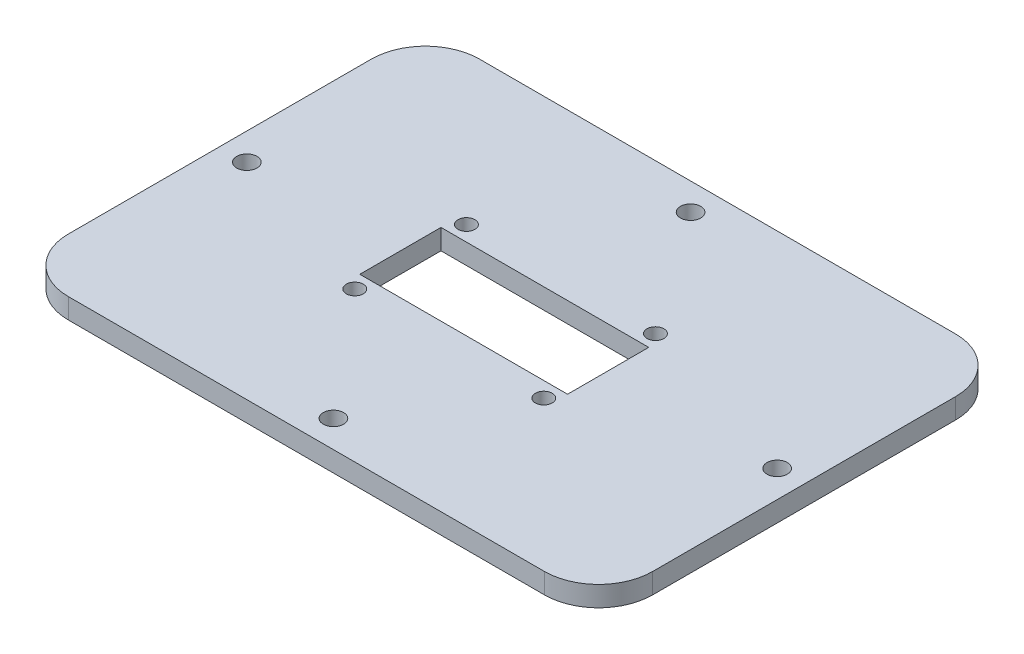
ISO-10303-21;
HEADER;
FILE_DESCRIPTION(('STEP AP214'),'2;1');
FILE_NAME('part.step','',(''),(''),'','','');
FILE_SCHEMA(('AUTOMOTIVE_DESIGN { 1 0 10303 214 1 1 1 1 }'));
ENDSEC;
DATA;
#1=APPLICATION_CONTEXT('core data for automotive mechanical design processes');
#2=APPLICATION_PROTOCOL_DEFINITION('international standard','automotive_design',2000,#1);
#3=PRODUCT_CONTEXT('',#1,'mechanical');
#4=PRODUCT('Part','Part','',(#3));
#5=PRODUCT_RELATED_PRODUCT_CATEGORY('part','',(#4));
#6=PRODUCT_DEFINITION_FORMATION('','',#4);
#7=PRODUCT_DEFINITION_CONTEXT('part definition',#1,'design');
#8=PRODUCT_DEFINITION('design','',#6,#7);
#9=PRODUCT_DEFINITION_SHAPE('','',#8);
#10=(LENGTH_UNIT() NAMED_UNIT(*) SI_UNIT(.MILLI.,.METRE.));
#11=(NAMED_UNIT(*) PLANE_ANGLE_UNIT() SI_UNIT($,.RADIAN.));
#12=(NAMED_UNIT(*) SI_UNIT($,.STERADIAN.) SOLID_ANGLE_UNIT());
#13=UNCERTAINTY_MEASURE_WITH_UNIT(LENGTH_MEASURE(1.E-05),#10,'distance_accuracy_value','');
#14=(GEOMETRIC_REPRESENTATION_CONTEXT(3) GLOBAL_UNCERTAINTY_ASSIGNED_CONTEXT((#13)) GLOBAL_UNIT_ASSIGNED_CONTEXT((#10,
#11,#12)) REPRESENTATION_CONTEXT('',''));
#15=CARTESIAN_POINT('',(0.,0.,0.));
#16=DIRECTION('',(0.,0.,1.));
#17=DIRECTION('',(1.,0.,0.));
#18=AXIS2_PLACEMENT_3D('',#15,#16,#17);
#19=CARTESIAN_POINT('',(-43.2,25.2,30.4));
#20=DIRECTION('',(0.,0.,-1.));
#21=DIRECTION('',(-1.,0.,0.));
#22=AXIS2_PLACEMENT_3D('',#19,#20,#21);
#23=PLANE('',#22);
#24=DIRECTION('',(1.,0.,0.));
#25=VECTOR('',#24,1.);
#26=CARTESIAN_POINT('',(35.2,22.2,30.4));
#27=LINE('',#26,#25);
#28=CARTESIAN_POINT('',(-35.2,22.2,30.4));
#29=VERTEX_POINT('',#28);
#30=CARTESIAN_POINT('',(35.2,22.2,30.4));
#31=VERTEX_POINT('',#30);
#32=EDGE_CURVE('E136',#29,#31,#27,.T.);
#33=ORIENTED_EDGE('',*,*,#32,.T.);
#34=DIRECTION('',(0.,-1.,0.));
#35=VECTOR('',#34,1.);
#36=CARTESIAN_POINT('',(35.2,25.2,30.4));
#37=LINE('',#36,#35);
#38=CARTESIAN_POINT('',(35.2,25.2,30.4));
#39=VERTEX_POINT('',#38);
#40=EDGE_CURVE('E161',#31,#39,#37,.F.);
#41=ORIENTED_EDGE('',*,*,#40,.T.);
#42=DIRECTION('',(1.,0.,0.));
#43=VECTOR('',#42,1.);
#44=CARTESIAN_POINT('',(-43.2,25.2,30.4));
#45=LINE('',#44,#43);
#46=CARTESIAN_POINT('',(-35.2,25.2,30.4));
#47=VERTEX_POINT('',#46);
#48=EDGE_CURVE('E159',#47,#39,#45,.T.);
#49=ORIENTED_EDGE('',*,*,#48,.F.);
#50=DIRECTION('',(0.,-1.,0.));
#51=VECTOR('',#50,1.);
#52=CARTESIAN_POINT('',(-35.2,25.2,30.4));
#53=LINE('',#52,#51);
#54=EDGE_CURVE('E153',#47,#29,#53,.T.);
#55=ORIENTED_EDGE('',*,*,#54,.T.);
#56=EDGE_LOOP('',(#33,#41,#49,#55));
#57=FACE_BOUND('',#56,.T.);
#58=ADVANCED_FACE('F41',(#57),#23,.F.);
#59=CARTESIAN_POINT('',(43.2,25.2,30.4));
#60=DIRECTION('',(-1.,0.,0.));
#61=DIRECTION('',(0.,0.,1.));
#62=AXIS2_PLACEMENT_3D('',#59,#60,#61);
#63=PLANE('',#62);
#64=DIRECTION('',(0.,0.,-1.));
#65=VECTOR('',#64,1.);
#66=CARTESIAN_POINT('',(43.2,22.2,-22.4));
#67=LINE('',#66,#65);
#68=CARTESIAN_POINT('',(43.2,22.2,22.4));
#69=VERTEX_POINT('',#68);
#70=CARTESIAN_POINT('',(43.2,22.2,-22.4));
#71=VERTEX_POINT('',#70);
#72=EDGE_CURVE('E252',#69,#71,#67,.T.);
#73=ORIENTED_EDGE('',*,*,#72,.T.);
#74=DIRECTION('',(0.,-1.,0.));
#75=VECTOR('',#74,1.);
#76=CARTESIAN_POINT('',(43.2,25.2,-22.4));
#77=LINE('',#76,#75);
#78=CARTESIAN_POINT('',(43.2,25.2,-22.4));
#79=VERTEX_POINT('',#78);
#80=EDGE_CURVE('E178',#71,#79,#77,.F.);
#81=ORIENTED_EDGE('',*,*,#80,.T.);
#82=DIRECTION('',(0.,0.,-1.));
#83=VECTOR('',#82,1.);
#84=CARTESIAN_POINT('',(43.2,25.2,30.4));
#85=LINE('',#84,#83);
#86=CARTESIAN_POINT('',(43.2,25.2,22.4));
#87=VERTEX_POINT('',#86);
#88=EDGE_CURVE('E223',#87,#79,#85,.T.);
#89=ORIENTED_EDGE('',*,*,#88,.F.);
#90=DIRECTION('',(0.,-1.,0.));
#91=VECTOR('',#90,1.);
#92=CARTESIAN_POINT('',(43.2,25.2,22.4));
#93=LINE('',#92,#91);
#94=EDGE_CURVE('E180',#87,#69,#93,.T.);
#95=ORIENTED_EDGE('',*,*,#94,.T.);
#96=EDGE_LOOP('',(#73,#81,#89,#95));
#97=FACE_BOUND('',#96,.T.);
#98=ADVANCED_FACE('F330',(#97),#63,.F.);
#99=CARTESIAN_POINT('',(43.2,25.2,-30.4));
#100=DIRECTION('',(0.,0.,1.));
#101=DIRECTION('',(1.,0.,0.));
#102=AXIS2_PLACEMENT_3D('',#99,#100,#101);
#103=PLANE('',#102);
#104=DIRECTION('',(-1.,0.,0.));
#105=VECTOR('',#104,1.);
#106=CARTESIAN_POINT('',(-35.2,22.2,-30.4));
#107=LINE('',#106,#105);
#108=CARTESIAN_POINT('',(35.2,22.2,-30.4));
#109=VERTEX_POINT('',#108);
#110=CARTESIAN_POINT('',(-35.2,22.2,-30.4));
#111=VERTEX_POINT('',#110);
#112=EDGE_CURVE('E58',#109,#111,#107,.T.);
#113=ORIENTED_EDGE('',*,*,#112,.T.);
#114=DIRECTION('',(0.,-1.,0.));
#115=VECTOR('',#114,1.);
#116=CARTESIAN_POINT('',(-35.2,25.2,-30.4));
#117=LINE('',#116,#115);
#118=CARTESIAN_POINT('',(-35.2,25.2,-30.4));
#119=VERTEX_POINT('',#118);
#120=EDGE_CURVE('E186',#111,#119,#117,.F.);
#121=ORIENTED_EDGE('',*,*,#120,.T.);
#122=DIRECTION('',(-1.,0.,0.));
#123=VECTOR('',#122,1.);
#124=CARTESIAN_POINT('',(43.2,25.2,-30.4));
#125=LINE('',#124,#123);
#126=CARTESIAN_POINT('',(35.2,25.2,-30.4));
#127=VERTEX_POINT('',#126);
#128=EDGE_CURVE('E231',#127,#119,#125,.T.);
#129=ORIENTED_EDGE('',*,*,#128,.F.);
#130=DIRECTION('',(0.,-1.,0.));
#131=VECTOR('',#130,1.);
#132=CARTESIAN_POINT('',(35.2,25.2,-30.4));
#133=LINE('',#132,#131);
#134=EDGE_CURVE('E183',#127,#109,#133,.T.);
#135=ORIENTED_EDGE('',*,*,#134,.T.);
#136=EDGE_LOOP('',(#113,#121,#129,#135));
#137=FACE_BOUND('',#136,.T.);
#138=ADVANCED_FACE('F335',(#137),#103,.F.);
#139=CARTESIAN_POINT('',(-43.2,25.2,-30.4));
#140=DIRECTION('',(1.,0.,0.));
#141=DIRECTION('',(0.,0.,-1.));
#142=AXIS2_PLACEMENT_3D('',#139,#140,#141);
#143=PLANE('',#142);
#144=DIRECTION('',(0.,0.,1.));
#145=VECTOR('',#144,1.);
#146=CARTESIAN_POINT('',(-43.2,22.2,22.4));
#147=LINE('',#146,#145);
#148=CARTESIAN_POINT('',(-43.2,22.2,-22.4));
#149=VERTEX_POINT('',#148);
#150=CARTESIAN_POINT('',(-43.2,22.2,22.4));
#151=VERTEX_POINT('',#150);
#152=EDGE_CURVE('E155',#149,#151,#147,.T.);
#153=ORIENTED_EDGE('',*,*,#152,.T.);
#154=DIRECTION('',(0.,-1.,0.));
#155=VECTOR('',#154,1.);
#156=CARTESIAN_POINT('',(-43.2,25.2,22.4));
#157=LINE('',#156,#155);
#158=CARTESIAN_POINT('',(-43.2,25.2,22.4));
#159=VERTEX_POINT('',#158);
#160=EDGE_CURVE('E154',#151,#159,#157,.F.);
#161=ORIENTED_EDGE('',*,*,#160,.T.);
#162=DIRECTION('',(0.,0.,1.));
#163=VECTOR('',#162,1.);
#164=CARTESIAN_POINT('',(-43.2,25.2,-30.4));
#165=LINE('',#164,#163);
#166=CARTESIAN_POINT('',(-43.2,25.2,-22.4));
#167=VERTEX_POINT('',#166);
#168=EDGE_CURVE('E165',#167,#159,#165,.T.);
#169=ORIENTED_EDGE('',*,*,#168,.F.);
#170=DIRECTION('',(0.,-1.,0.));
#171=VECTOR('',#170,1.);
#172=CARTESIAN_POINT('',(-43.2,25.2,-22.4));
#173=LINE('',#172,#171);
#174=EDGE_CURVE('E160',#167,#149,#173,.T.);
#175=ORIENTED_EDGE('',*,*,#174,.T.);
#176=EDGE_LOOP('',(#153,#161,#169,#175));
#177=FACE_BOUND('',#176,.T.);
#178=ADVANCED_FACE('F240',(#177),#143,.F.);
#179=CARTESIAN_POINT('',(-16.5,25.2,-6.));
#180=DIRECTION('',(0.,0.,-1.));
#181=DIRECTION('',(-1.,0.,0.));
#182=AXIS2_PLACEMENT_3D('',#179,#180,#181);
#183=PLANE('',#182);
#184=DIRECTION('',(-1.,0.,0.));
#185=VECTOR('',#184,1.);
#186=CARTESIAN_POINT('',(-16.5,22.2,-6.));
#187=LINE('',#186,#185);
#188=CARTESIAN_POINT('',(16.214,22.2,-6.));
#189=VERTEX_POINT('',#188);
#190=CARTESIAN_POINT('',(-16.5,22.2,-6.));
#191=VERTEX_POINT('',#190);
#192=EDGE_CURVE('E204',#189,#191,#187,.T.);
#193=ORIENTED_EDGE('',*,*,#192,.F.);
#194=DIRECTION('',(0.70710678118655,-0.707106781186545,0.));
#195=VECTOR('',#194,1.);
#196=CARTESIAN_POINT('',(-1.64300000000009,40.057,-6.));
#197=LINE('',#196,#195);
#198=CARTESIAN_POINT('',(14.214,24.2,-6.));
#199=VERTEX_POINT('',#198);
#200=EDGE_CURVE('E11',#189,#199,#197,.F.);
#201=ORIENTED_EDGE('',*,*,#200,.T.);
#202=DIRECTION('',(0.,1.,0.));
#203=VECTOR('',#202,1.);
#204=CARTESIAN_POINT('',(14.214,22.2,-6.));
#205=LINE('',#204,#203);
#206=CARTESIAN_POINT('',(14.214,25.2,-6.));
#207=VERTEX_POINT('',#206);
#208=EDGE_CURVE('E286',#199,#207,#205,.T.);
#209=ORIENTED_EDGE('',*,*,#208,.T.);
#210=DIRECTION('',(1.,0.,0.));
#211=VECTOR('',#210,1.);
#212=CARTESIAN_POINT('',(-16.5,25.2,-6.));
#213=LINE('',#212,#211);
#214=CARTESIAN_POINT('',(-16.5,25.2,-6.));
#215=VERTEX_POINT('',#214);
#216=EDGE_CURVE('E220',#215,#207,#213,.T.);
#217=ORIENTED_EDGE('',*,*,#216,.F.);
#218=DIRECTION('',(0.,-1.,0.));
#219=VECTOR('',#218,1.);
#220=CARTESIAN_POINT('',(-16.5,25.2,-6.));
#221=LINE('',#220,#219);
#222=EDGE_CURVE('E214',#215,#191,#221,.T.);
#223=ORIENTED_EDGE('',*,*,#222,.T.);
#224=EDGE_LOOP('',(#193,#201,#209,#217,#223));
#225=FACE_BOUND('',#224,.T.);
#226=ADVANCED_FACE('F218',(#225),#183,.F.);
#227=CARTESIAN_POINT('',(-16.5,25.2,-6.));
#228=DIRECTION('',(-1.,0.,0.));
#229=DIRECTION('',(0.,0.,1.));
#230=AXIS2_PLACEMENT_3D('',#227,#228,#229);
#231=PLANE('',#230);
#232=DIRECTION('',(0.,0.,1.));
#233=VECTOR('',#232,1.);
#234=CARTESIAN_POINT('',(-16.5,22.2,-6.));
#235=LINE('',#234,#233);
#236=CARTESIAN_POINT('',(-16.5,22.2,6.));
#237=VERTEX_POINT('',#236);
#238=EDGE_CURVE('E206',#191,#237,#235,.T.);
#239=ORIENTED_EDGE('',*,*,#238,.F.);
#240=ORIENTED_EDGE('',*,*,#222,.F.);
#241=DIRECTION('',(0.,0.,-1.));
#242=VECTOR('',#241,1.);
#243=CARTESIAN_POINT('',(-16.5,25.2,-6.));
#244=LINE('',#243,#242);
#245=CARTESIAN_POINT('',(-16.5,25.2,6.));
#246=VERTEX_POINT('',#245);
#247=EDGE_CURVE('E308',#246,#215,#244,.T.);
#248=ORIENTED_EDGE('',*,*,#247,.F.);
#249=DIRECTION('',(0.,-1.,0.));
#250=VECTOR('',#249,1.);
#251=CARTESIAN_POINT('',(-16.5,25.2,6.));
#252=LINE('',#251,#250);
#253=EDGE_CURVE('E216',#246,#237,#252,.T.);
#254=ORIENTED_EDGE('',*,*,#253,.T.);
#255=EDGE_LOOP('',(#239,#240,#248,#254));
#256=FACE_BOUND('',#255,.T.);
#257=ADVANCED_FACE('F212',(#256),#231,.F.);
#258=CARTESIAN_POINT('',(-16.5,25.2,6.));
#259=DIRECTION('',(0.,0.,1.));
#260=DIRECTION('',(1.,0.,0.));
#261=AXIS2_PLACEMENT_3D('',#258,#259,#260);
#262=PLANE('',#261);
#263=DIRECTION('',(1.,0.,0.));
#264=VECTOR('',#263,1.);
#265=CARTESIAN_POINT('',(-16.5,22.2,6.));
#266=LINE('',#265,#264);
#267=CARTESIAN_POINT('',(16.214,22.2,6.));
#268=VERTEX_POINT('',#267);
#269=EDGE_CURVE('E66',#237,#268,#266,.T.);
#270=ORIENTED_EDGE('',*,*,#269,.F.);
#271=ORIENTED_EDGE('',*,*,#253,.F.);
#272=DIRECTION('',(-1.,0.,0.));
#273=VECTOR('',#272,1.);
#274=CARTESIAN_POINT('',(-16.5,25.2,6.));
#275=LINE('',#274,#273);
#276=CARTESIAN_POINT('',(14.214,25.2,6.));
#277=VERTEX_POINT('',#276);
#278=EDGE_CURVE('E307',#277,#246,#275,.T.);
#279=ORIENTED_EDGE('',*,*,#278,.F.);
#280=DIRECTION('',(0.,1.,0.));
#281=VECTOR('',#280,1.);
#282=CARTESIAN_POINT('',(14.214,22.2,6.));
#283=LINE('',#282,#281);
#284=CARTESIAN_POINT('',(14.214,24.2,6.));
#285=VERTEX_POINT('',#284);
#286=EDGE_CURVE('E200',#285,#277,#283,.T.);
#287=ORIENTED_EDGE('',*,*,#286,.F.);
#288=DIRECTION('',(-0.70710678118655,0.707106781186545,0.));
#289=VECTOR('',#288,1.);
#290=CARTESIAN_POINT('',(-1.64300000000009,40.057,6.));
#291=LINE('',#290,#289);
#292=EDGE_CURVE('E51',#285,#268,#291,.F.);
#293=ORIENTED_EDGE('',*,*,#292,.T.);
#294=EDGE_LOOP('',(#270,#271,#279,#287,#293));
#295=FACE_BOUND('',#294,.T.);
#296=ADVANCED_FACE('F196',(#295),#262,.F.);
#297=CARTESIAN_POINT('',(-14.986,25.2,8.255));
#298=DIRECTION('',(0.,-1.,0.));
#299=DIRECTION('',(0.,0.,-1.));
#300=AXIS2_PLACEMENT_3D('',#297,#298,#299);
#301=CYLINDRICAL_SURFACE('',#300,1.25);
#302=CARTESIAN_POINT('',(-14.986,25.2,8.255));
#303=DIRECTION('',(0.,-1.,0.));
#304=DIRECTION('',(0.,0.,-1.));
#305=AXIS2_PLACEMENT_3D('',#302,#303,#304);
#306=CIRCLE('',#305,1.25);
#307=CARTESIAN_POINT('',(-14.986,25.2,7.005));
#308=VERTEX_POINT('',#307);
#309=EDGE_CURVE('E304',#308,#308,#306,.T.);
#310=ORIENTED_EDGE('',*,*,#309,.F.);
#311=EDGE_LOOP('',(#310));
#312=FACE_BOUND('',#311,.T.);
#313=CARTESIAN_POINT('',(-14.986,22.2,8.255));
#314=DIRECTION('',(0.,-1.,0.));
#315=DIRECTION('',(0.,0.,-1.));
#316=AXIS2_PLACEMENT_3D('',#313,#314,#315);
#317=CIRCLE('',#316,1.25);
#318=CARTESIAN_POINT('',(-14.986,22.2,7.005));
#319=VERTEX_POINT('',#318);
#320=EDGE_CURVE('E274',#319,#319,#317,.F.);
#321=ORIENTED_EDGE('',*,*,#320,.F.);
#322=EDGE_LOOP('',(#321));
#323=FACE_BOUND('',#322,.T.);
#324=ADVANCED_FACE('F373',(#312,#323),#301,.F.);
#325=CARTESIAN_POINT('',(-14.986,25.2,-8.255));
#326=DIRECTION('',(0.,-1.,0.));
#327=DIRECTION('',(0.,0.,-1.));
#328=AXIS2_PLACEMENT_3D('',#325,#326,#327);
#329=CYLINDRICAL_SURFACE('',#328,1.25);
#330=CARTESIAN_POINT('',(-14.986,25.2,-8.255));
#331=DIRECTION('',(0.,-1.,0.));
#332=DIRECTION('',(0.,0.,-1.));
#333=AXIS2_PLACEMENT_3D('',#330,#331,#332);
#334=CIRCLE('',#333,1.25);
#335=CARTESIAN_POINT('',(-14.986,25.2,-9.505));
#336=VERTEX_POINT('',#335);
#337=EDGE_CURVE('E293',#336,#336,#334,.T.);
#338=ORIENTED_EDGE('',*,*,#337,.F.);
#339=EDGE_LOOP('',(#338));
#340=FACE_BOUND('',#339,.T.);
#341=CARTESIAN_POINT('',(-14.986,22.2,-8.255));
#342=DIRECTION('',(0.,-1.,0.));
#343=DIRECTION('',(0.,0.,-1.));
#344=AXIS2_PLACEMENT_3D('',#341,#342,#343);
#345=CIRCLE('',#344,1.25);
#346=CARTESIAN_POINT('',(-14.986,22.2,-9.505));
#347=VERTEX_POINT('',#346);
#348=EDGE_CURVE('E271',#347,#347,#345,.F.);
#349=ORIENTED_EDGE('',*,*,#348,.F.);
#350=EDGE_LOOP('',(#349));
#351=FACE_BOUND('',#350,.T.);
#352=ADVANCED_FACE('F380',(#340,#351),#329,.F.);
#353=CARTESIAN_POINT('',(39.2,25.2,0.));
#354=DIRECTION('',(0.,-1.,0.));
#355=DIRECTION('',(0.,0.,-1.));
#356=AXIS2_PLACEMENT_3D('',#353,#354,#355);
#357=CYLINDRICAL_SURFACE('',#356,1.5);
#358=CARTESIAN_POINT('',(39.2,25.2,0.));
#359=DIRECTION('',(0.,-1.,0.));
#360=DIRECTION('',(0.,0.,-1.));
#361=AXIS2_PLACEMENT_3D('',#358,#359,#360);
#362=CIRCLE('',#361,1.5);
#363=CARTESIAN_POINT('',(39.2,25.2,-1.50000000000001));
#364=VERTEX_POINT('',#363);
#365=EDGE_CURVE('E288',#364,#364,#362,.T.);
#366=ORIENTED_EDGE('',*,*,#365,.F.);
#367=EDGE_LOOP('',(#366));
#368=FACE_BOUND('',#367,.T.);
#369=CARTESIAN_POINT('',(39.2,22.2,0.));
#370=DIRECTION('',(0.,-1.,0.));
#371=DIRECTION('',(0.,0.,-1.));
#372=AXIS2_PLACEMENT_3D('',#369,#370,#371);
#373=CIRCLE('',#372,1.5);
#374=CARTESIAN_POINT('',(39.2,22.2,-1.50000000000001));
#375=VERTEX_POINT('',#374);
#376=EDGE_CURVE('E268',#375,#375,#373,.F.);
#377=ORIENTED_EDGE('',*,*,#376,.F.);
#378=EDGE_LOOP('',(#377));
#379=FACE_BOUND('',#378,.T.);
#380=ADVANCED_FACE('F384',(#368,#379),#357,.F.);
#381=CARTESIAN_POINT('',(0.,25.2,-26.4));
#382=DIRECTION('',(0.,-1.,0.));
#383=DIRECTION('',(0.,0.,-1.));
#384=AXIS2_PLACEMENT_3D('',#381,#382,#383);
#385=CYLINDRICAL_SURFACE('',#384,1.5);
#386=CARTESIAN_POINT('',(0.,25.2,-26.4));
#387=DIRECTION('',(0.,-1.,0.));
#388=DIRECTION('',(0.,0.,-1.));
#389=AXIS2_PLACEMENT_3D('',#386,#387,#388);
#390=CIRCLE('',#389,1.5);
#391=CARTESIAN_POINT('',(0.,25.2,-27.9));
#392=VERTEX_POINT('',#391);
#393=EDGE_CURVE('E297',#392,#392,#390,.T.);
#394=ORIENTED_EDGE('',*,*,#393,.F.);
#395=EDGE_LOOP('',(#394));
#396=FACE_BOUND('',#395,.T.);
#397=CARTESIAN_POINT('',(0.,22.2,-26.4));
#398=DIRECTION('',(0.,-1.,0.));
#399=DIRECTION('',(0.,0.,-1.));
#400=AXIS2_PLACEMENT_3D('',#397,#398,#399);
#401=CIRCLE('',#400,1.5);
#402=CARTESIAN_POINT('',(0.,22.2,-27.9));
#403=VERTEX_POINT('',#402);
#404=EDGE_CURVE('E265',#403,#403,#401,.F.);
#405=ORIENTED_EDGE('',*,*,#404,.F.);
#406=EDGE_LOOP('',(#405));
#407=FACE_BOUND('',#406,.T.);
#408=ADVANCED_FACE('F388',(#396,#407),#385,.F.);
#409=CARTESIAN_POINT('',(-39.2,25.2,0.));
#410=DIRECTION('',(0.,-1.,0.));
#411=DIRECTION('',(0.,0.,-1.));
#412=AXIS2_PLACEMENT_3D('',#409,#410,#411);
#413=CYLINDRICAL_SURFACE('',#412,1.5);
#414=CARTESIAN_POINT('',(-39.2,25.2,0.));
#415=DIRECTION('',(0.,-1.,0.));
#416=DIRECTION('',(0.,0.,-1.));
#417=AXIS2_PLACEMENT_3D('',#414,#415,#416);
#418=CIRCLE('',#417,1.5);
#419=CARTESIAN_POINT('',(-39.2,25.2,-1.5));
#420=VERTEX_POINT('',#419);
#421=EDGE_CURVE('E294',#420,#420,#418,.T.);
#422=ORIENTED_EDGE('',*,*,#421,.F.);
#423=EDGE_LOOP('',(#422));
#424=FACE_BOUND('',#423,.T.);
#425=CARTESIAN_POINT('',(-39.2,22.2,0.));
#426=DIRECTION('',(0.,-1.,0.));
#427=DIRECTION('',(0.,0.,-1.));
#428=AXIS2_PLACEMENT_3D('',#425,#426,#427);
#429=CIRCLE('',#428,1.5);
#430=CARTESIAN_POINT('',(-39.2,22.2,-1.5));
#431=VERTEX_POINT('',#430);
#432=EDGE_CURVE('E262',#431,#431,#429,.F.);
#433=ORIENTED_EDGE('',*,*,#432,.F.);
#434=EDGE_LOOP('',(#433));
#435=FACE_BOUND('',#434,.T.);
#436=ADVANCED_FACE('F392',(#424,#435),#413,.F.);
#437=CARTESIAN_POINT('',(0.,25.2,26.4));
#438=DIRECTION('',(0.,-1.,0.));
#439=DIRECTION('',(0.,0.,-1.));
#440=AXIS2_PLACEMENT_3D('',#437,#438,#439);
#441=CYLINDRICAL_SURFACE('',#440,1.5);
#442=CARTESIAN_POINT('',(0.,25.2,26.4));
#443=DIRECTION('',(0.,-1.,0.));
#444=DIRECTION('',(0.,0.,-1.));
#445=AXIS2_PLACEMENT_3D('',#442,#443,#444);
#446=CIRCLE('',#445,1.5);
#447=CARTESIAN_POINT('',(0.,25.2,24.9));
#448=VERTEX_POINT('',#447);
#449=EDGE_CURVE('E290',#448,#448,#446,.T.);
#450=ORIENTED_EDGE('',*,*,#449,.F.);
#451=EDGE_LOOP('',(#450));
#452=FACE_BOUND('',#451,.T.);
#453=CARTESIAN_POINT('',(0.,22.2,26.4));
#454=DIRECTION('',(0.,-1.,0.));
#455=DIRECTION('',(0.,0.,-1.));
#456=AXIS2_PLACEMENT_3D('',#453,#454,#455);
#457=CIRCLE('',#456,1.5);
#458=CARTESIAN_POINT('',(0.,22.2,24.9));
#459=VERTEX_POINT('',#458);
#460=EDGE_CURVE('E258',#459,#459,#457,.F.);
#461=ORIENTED_EDGE('',*,*,#460,.F.);
#462=EDGE_LOOP('',(#461));
#463=FACE_BOUND('',#462,.T.);
#464=ADVANCED_FACE('F343',(#452,#463),#441,.F.);
#465=CARTESIAN_POINT('',(-35.2,25.2,22.4));
#466=DIRECTION('',(0.,-1.,0.));
#467=DIRECTION('',(0.,0.,-1.));
#468=AXIS2_PLACEMENT_3D('',#465,#466,#467);
#469=CYLINDRICAL_SURFACE('',#468,8.);
#470=ORIENTED_EDGE('',*,*,#160,.F.);
#471=CARTESIAN_POINT('',(-35.2,22.2,22.4));
#472=DIRECTION('',(0.,-1.,0.));
#473=DIRECTION('',(0.,0.,-1.));
#474=AXIS2_PLACEMENT_3D('',#471,#472,#473);
#475=CIRCLE('',#474,8.);
#476=EDGE_CURVE('E140',#151,#29,#475,.F.);
#477=ORIENTED_EDGE('',*,*,#476,.T.);
#478=ORIENTED_EDGE('',*,*,#54,.F.);
#479=CARTESIAN_POINT('',(-35.2,25.2,22.4));
#480=DIRECTION('',(0.,1.,0.));
#481=DIRECTION('',(0.,0.,1.));
#482=AXIS2_PLACEMENT_3D('',#479,#480,#481);
#483=CIRCLE('',#482,8.);
#484=EDGE_CURVE('E176',#159,#47,#483,.T.);
#485=ORIENTED_EDGE('',*,*,#484,.F.);
#486=EDGE_LOOP('',(#470,#477,#478,#485));
#487=FACE_BOUND('',#486,.T.);
#488=ADVANCED_FACE('F151',(#487),#469,.T.);
#489=CARTESIAN_POINT('',(35.2,25.2,22.4));
#490=DIRECTION('',(0.,-1.,0.));
#491=DIRECTION('',(0.,0.,-1.));
#492=AXIS2_PLACEMENT_3D('',#489,#490,#491);
#493=CYLINDRICAL_SURFACE('',#492,8.);
#494=ORIENTED_EDGE('',*,*,#40,.F.);
#495=CARTESIAN_POINT('',(35.2,22.2,22.4));
#496=DIRECTION('',(0.,-1.,0.));
#497=DIRECTION('',(0.,0.,-1.));
#498=AXIS2_PLACEMENT_3D('',#495,#496,#497);
#499=CIRCLE('',#498,8.);
#500=EDGE_CURVE('E143',#31,#69,#499,.F.);
#501=ORIENTED_EDGE('',*,*,#500,.T.);
#502=ORIENTED_EDGE('',*,*,#94,.F.);
#503=CARTESIAN_POINT('',(35.2,25.2,22.4));
#504=DIRECTION('',(0.,1.,0.));
#505=DIRECTION('',(0.,0.,1.));
#506=AXIS2_PLACEMENT_3D('',#503,#504,#505);
#507=CIRCLE('',#506,8.);
#508=EDGE_CURVE('E174',#39,#87,#507,.T.);
#509=ORIENTED_EDGE('',*,*,#508,.F.);
#510=EDGE_LOOP('',(#494,#501,#502,#509));
#511=FACE_BOUND('',#510,.T.);
#512=ADVANCED_FACE('F342',(#511),#493,.T.);
#513=CARTESIAN_POINT('',(-35.2,25.2,-22.4));
#514=DIRECTION('',(0.,-1.,0.));
#515=DIRECTION('',(0.,0.,-1.));
#516=AXIS2_PLACEMENT_3D('',#513,#514,#515);
#517=CYLINDRICAL_SURFACE('',#516,8.);
#518=ORIENTED_EDGE('',*,*,#120,.F.);
#519=CARTESIAN_POINT('',(-35.2,22.2,-22.4));
#520=DIRECTION('',(0.,-1.,0.));
#521=DIRECTION('',(0.,0.,-1.));
#522=AXIS2_PLACEMENT_3D('',#519,#520,#521);
#523=CIRCLE('',#522,8.);
#524=EDGE_CURVE('E245',#111,#149,#523,.F.);
#525=ORIENTED_EDGE('',*,*,#524,.T.);
#526=ORIENTED_EDGE('',*,*,#174,.F.);
#527=CARTESIAN_POINT('',(-35.2,25.2,-22.4));
#528=DIRECTION('',(0.,1.,0.));
#529=DIRECTION('',(0.,0.,1.));
#530=AXIS2_PLACEMENT_3D('',#527,#528,#529);
#531=CIRCLE('',#530,8.);
#532=EDGE_CURVE('E172',#119,#167,#531,.T.);
#533=ORIENTED_EDGE('',*,*,#532,.F.);
#534=EDGE_LOOP('',(#518,#525,#526,#533));
#535=FACE_BOUND('',#534,.T.);
#536=ADVANCED_FACE('F244',(#535),#517,.T.);
#537=CARTESIAN_POINT('',(35.2,25.2,-22.4));
#538=DIRECTION('',(0.,-1.,0.));
#539=DIRECTION('',(0.,0.,-1.));
#540=AXIS2_PLACEMENT_3D('',#537,#538,#539);
#541=CYLINDRICAL_SURFACE('',#540,8.);
#542=ORIENTED_EDGE('',*,*,#80,.F.);
#543=CARTESIAN_POINT('',(35.2,22.2,-22.4));
#544=DIRECTION('',(0.,-1.,0.));
#545=DIRECTION('',(0.,0.,-1.));
#546=AXIS2_PLACEMENT_3D('',#543,#544,#545);
#547=CIRCLE('',#546,8.);
#548=EDGE_CURVE('E247',#71,#109,#547,.F.);
#549=ORIENTED_EDGE('',*,*,#548,.T.);
#550=ORIENTED_EDGE('',*,*,#134,.F.);
#551=CARTESIAN_POINT('',(35.2,25.2,-22.4));
#552=DIRECTION('',(0.,1.,0.));
#553=DIRECTION('',(0.,0.,1.));
#554=AXIS2_PLACEMENT_3D('',#551,#552,#553);
#555=CIRCLE('',#554,8.);
#556=EDGE_CURVE('E170',#79,#127,#555,.T.);
#557=ORIENTED_EDGE('',*,*,#556,.F.);
#558=EDGE_LOOP('',(#542,#549,#550,#557));
#559=FACE_BOUND('',#558,.T.);
#560=ADVANCED_FACE('F348',(#559),#541,.T.);
#561=CARTESIAN_POINT('',(12.954,16.6644660940673,-8.255));
#562=DIRECTION('',(0.,1.,0.));
#563=DIRECTION('',(0.,0.,1.));
#564=AXIS2_PLACEMENT_3D('',#561,#562,#563);
#565=CYLINDRICAL_SURFACE('',#564,1.25);
#566=CARTESIAN_POINT('',(12.954,25.2,-8.255));
#567=DIRECTION('',(0.,1.,0.));
#568=DIRECTION('',(0.,0.,1.));
#569=AXIS2_PLACEMENT_3D('',#566,#567,#568);
#570=CIRCLE('',#569,1.25);
#571=CARTESIAN_POINT('',(12.954,25.2,-7.005));
#572=VERTEX_POINT('',#571);
#573=EDGE_CURVE('E277',#572,#572,#570,.T.);
#574=ORIENTED_EDGE('',*,*,#573,.T.);
#575=EDGE_LOOP('',(#574));
#576=FACE_BOUND('',#575,.T.);
#577=CARTESIAN_POINT('',(12.954,22.2,-8.255));
#578=DIRECTION('',(0.,-1.,0.));
#579=DIRECTION('',(0.,0.,-1.));
#580=AXIS2_PLACEMENT_3D('',#577,#578,#579);
#581=CIRCLE('',#580,1.25);
#582=CARTESIAN_POINT('',(12.954,22.2,-9.505));
#583=VERTEX_POINT('',#582);
#584=EDGE_CURVE('E209',#583,#583,#581,.F.);
#585=ORIENTED_EDGE('',*,*,#584,.F.);
#586=EDGE_LOOP('',(#585));
#587=FACE_BOUND('',#586,.T.);
#588=ADVANCED_FACE('F350',(#576,#587),#565,.F.);
#589=CARTESIAN_POINT('',(12.954,16.6644660940673,8.25499999999999));
#590=DIRECTION('',(0.,1.,0.));
#591=DIRECTION('',(0.,0.,1.));
#592=AXIS2_PLACEMENT_3D('',#589,#590,#591);
#593=CYLINDRICAL_SURFACE('',#592,1.25);
#594=CARTESIAN_POINT('',(12.954,25.2,8.25499999999999));
#595=DIRECTION('',(0.,1.,0.));
#596=DIRECTION('',(0.,0.,1.));
#597=AXIS2_PLACEMENT_3D('',#594,#595,#596);
#598=CIRCLE('',#597,1.25);
#599=CARTESIAN_POINT('',(12.954,25.2,9.50499999999999));
#600=VERTEX_POINT('',#599);
#601=EDGE_CURVE('E278',#600,#600,#598,.T.);
#602=ORIENTED_EDGE('',*,*,#601,.T.);
#603=EDGE_LOOP('',(#602));
#604=FACE_BOUND('',#603,.T.);
#605=CARTESIAN_POINT('',(12.954,22.2,8.25499999999999));
#606=DIRECTION('',(0.,-1.,0.));
#607=DIRECTION('',(0.,0.,-1.));
#608=AXIS2_PLACEMENT_3D('',#605,#606,#607);
#609=CIRCLE('',#608,1.25);
#610=CARTESIAN_POINT('',(12.954,22.2,7.00499999999999));
#611=VERTEX_POINT('',#610);
#612=EDGE_CURVE('E46',#611,#611,#609,.F.);
#613=ORIENTED_EDGE('',*,*,#612,.F.);
#614=EDGE_LOOP('',(#613));
#615=FACE_BOUND('',#614,.T.);
#616=ADVANCED_FACE('F325',(#604,#615),#593,.F.);
#617=CARTESIAN_POINT('',(0.,25.2,0.));
#618=DIRECTION('',(0.,1.,0.));
#619=DIRECTION('',(0.,0.,1.));
#620=AXIS2_PLACEMENT_3D('',#617,#618,#619);
#621=PLANE('',#620);
#622=ORIENTED_EDGE('',*,*,#601,.F.);
#623=EDGE_LOOP('',(#622));
#624=FACE_BOUND('',#623,.T.);
#625=ORIENTED_EDGE('',*,*,#573,.F.);
#626=EDGE_LOOP('',(#625));
#627=FACE_BOUND('',#626,.T.);
#628=ORIENTED_EDGE('',*,*,#216,.T.);
#629=DIRECTION('',(0.,0.,1.));
#630=VECTOR('',#629,1.);
#631=CARTESIAN_POINT('',(14.214,25.2,-6.));
#632=LINE('',#631,#630);
#633=EDGE_CURVE('E281',#207,#277,#632,.T.);
#634=ORIENTED_EDGE('',*,*,#633,.T.);
#635=ORIENTED_EDGE('',*,*,#278,.T.);
#636=ORIENTED_EDGE('',*,*,#247,.T.);
#637=EDGE_LOOP('',(#628,#634,#635,#636));
#638=FACE_BOUND('',#637,.T.);
#639=ORIENTED_EDGE('',*,*,#449,.T.);
#640=EDGE_LOOP('',(#639));
#641=FACE_BOUND('',#640,.T.);
#642=ORIENTED_EDGE('',*,*,#421,.T.);
#643=EDGE_LOOP('',(#642));
#644=FACE_BOUND('',#643,.T.);
#645=ORIENTED_EDGE('',*,*,#393,.T.);
#646=EDGE_LOOP('',(#645));
#647=FACE_BOUND('',#646,.T.);
#648=ORIENTED_EDGE('',*,*,#365,.T.);
#649=EDGE_LOOP('',(#648));
#650=FACE_BOUND('',#649,.T.);
#651=ORIENTED_EDGE('',*,*,#337,.T.);
#652=EDGE_LOOP('',(#651));
#653=FACE_BOUND('',#652,.T.);
#654=ORIENTED_EDGE('',*,*,#309,.T.);
#655=EDGE_LOOP('',(#654));
#656=FACE_BOUND('',#655,.T.);
#657=ORIENTED_EDGE('',*,*,#168,.T.);
#658=ORIENTED_EDGE('',*,*,#484,.T.);
#659=ORIENTED_EDGE('',*,*,#48,.T.);
#660=ORIENTED_EDGE('',*,*,#508,.T.);
#661=ORIENTED_EDGE('',*,*,#88,.T.);
#662=ORIENTED_EDGE('',*,*,#556,.T.);
#663=ORIENTED_EDGE('',*,*,#128,.T.);
#664=ORIENTED_EDGE('',*,*,#532,.T.);
#665=EDGE_LOOP('',(#657,#658,#659,#660,#661,#662,#663,#664));
#666=FACE_BOUND('',#665,.T.);
#667=ADVANCED_FACE('F236',(#624,#627,#638,#641,#644,#647,#650,#653,#656,#666),#621,.T.);
#668=CARTESIAN_POINT('',(14.214,22.2,-6.));
#669=DIRECTION('',(-1.,0.,0.));
#670=DIRECTION('',(0.,0.,1.));
#671=AXIS2_PLACEMENT_3D('',#668,#669,#670);
#672=PLANE('',#671);
#673=ORIENTED_EDGE('',*,*,#208,.F.);
#674=DIRECTION('',(0.,0.,1.));
#675=VECTOR('',#674,1.);
#676=CARTESIAN_POINT('',(14.214,24.2,-6.));
#677=LINE('',#676,#675);
#678=EDGE_CURVE('E188',#199,#285,#677,.T.);
#679=ORIENTED_EDGE('',*,*,#678,.T.);
#680=ORIENTED_EDGE('',*,*,#286,.T.);
#681=ORIENTED_EDGE('',*,*,#633,.F.);
#682=EDGE_LOOP('',(#673,#679,#680,#681));
#683=FACE_BOUND('',#682,.T.);
#684=ADVANCED_FACE('F314',(#683),#672,.T.);
#685=CARTESIAN_POINT('',(0.,22.2,0.));
#686=DIRECTION('',(0.,-1.,0.));
#687=DIRECTION('',(0.,0.,-1.));
#688=AXIS2_PLACEMENT_3D('',#685,#686,#687);
#689=PLANE('',#688);
#690=DIRECTION('',(0.,0.,-1.));
#691=VECTOR('',#690,1.);
#692=CARTESIAN_POINT('',(16.214,22.2,0.));
#693=LINE('',#692,#691);
#694=EDGE_CURVE('E191',#268,#189,#693,.T.);
#695=ORIENTED_EDGE('',*,*,#694,.T.);
#696=ORIENTED_EDGE('',*,*,#192,.T.);
#697=ORIENTED_EDGE('',*,*,#238,.T.);
#698=ORIENTED_EDGE('',*,*,#269,.T.);
#699=EDGE_LOOP('',(#695,#696,#697,#698));
#700=FACE_BOUND('',#699,.T.);
#701=ORIENTED_EDGE('',*,*,#500,.F.);
#702=ORIENTED_EDGE('',*,*,#32,.F.);
#703=ORIENTED_EDGE('',*,*,#476,.F.);
#704=ORIENTED_EDGE('',*,*,#152,.F.);
#705=ORIENTED_EDGE('',*,*,#524,.F.);
#706=ORIENTED_EDGE('',*,*,#112,.F.);
#707=ORIENTED_EDGE('',*,*,#548,.F.);
#708=ORIENTED_EDGE('',*,*,#72,.F.);
#709=EDGE_LOOP('',(#701,#702,#703,#704,#705,#706,#707,#708));
#710=FACE_BOUND('',#709,.T.);
#711=ORIENTED_EDGE('',*,*,#612,.T.);
#712=EDGE_LOOP('',(#711));
#713=FACE_BOUND('',#712,.T.);
#714=ORIENTED_EDGE('',*,*,#584,.T.);
#715=EDGE_LOOP('',(#714));
#716=FACE_BOUND('',#715,.T.);
#717=ORIENTED_EDGE('',*,*,#460,.T.);
#718=EDGE_LOOP('',(#717));
#719=FACE_BOUND('',#718,.T.);
#720=ORIENTED_EDGE('',*,*,#432,.T.);
#721=EDGE_LOOP('',(#720));
#722=FACE_BOUND('',#721,.T.);
#723=ORIENTED_EDGE('',*,*,#404,.T.);
#724=EDGE_LOOP('',(#723));
#725=FACE_BOUND('',#724,.T.);
#726=ORIENTED_EDGE('',*,*,#376,.T.);
#727=EDGE_LOOP('',(#726));
#728=FACE_BOUND('',#727,.T.);
#729=ORIENTED_EDGE('',*,*,#348,.T.);
#730=EDGE_LOOP('',(#729));
#731=FACE_BOUND('',#730,.T.);
#732=ORIENTED_EDGE('',*,*,#320,.T.);
#733=EDGE_LOOP('',(#732));
#734=FACE_BOUND('',#733,.T.);
#735=ADVANCED_FACE('F138',(#700,#710,#713,#716,#719,#722,#725,#728,#731,#734),#689,.T.);
#736=CARTESIAN_POINT('',(14.214,24.2,-6.));
#737=DIRECTION('',(0.707106781186545,0.70710678118655,0.));
#738=DIRECTION('',(0.,0.,1.));
#739=AXIS2_PLACEMENT_3D('',#736,#737,#738);
#740=PLANE('',#739);
#741=ORIENTED_EDGE('',*,*,#200,.F.);
#742=ORIENTED_EDGE('',*,*,#694,.F.);
#743=ORIENTED_EDGE('',*,*,#292,.F.);
#744=ORIENTED_EDGE('',*,*,#678,.F.);
#745=EDGE_LOOP('',(#741,#742,#743,#744));
#746=FACE_BOUND('',#745,.T.);
#747=ADVANCED_FACE('F44',(#746),#740,.F.);
#748=CLOSED_SHELL('',(#58,#98,#138,#178,#226,#257,#296,#324,#352,#380,#408,#436,#464,#488,#512,
#536,#560,#588,#616,#667,#684,#735,#747));
#749=MANIFOLD_SOLID_BREP('B2',#748);
#750=ADVANCED_BREP_SHAPE_REPRESENTATION('',(#18,#749),#14);
#751=SHAPE_DEFINITION_REPRESENTATION(#9,#750);
ENDSEC;
END-ISO-10303-21;
